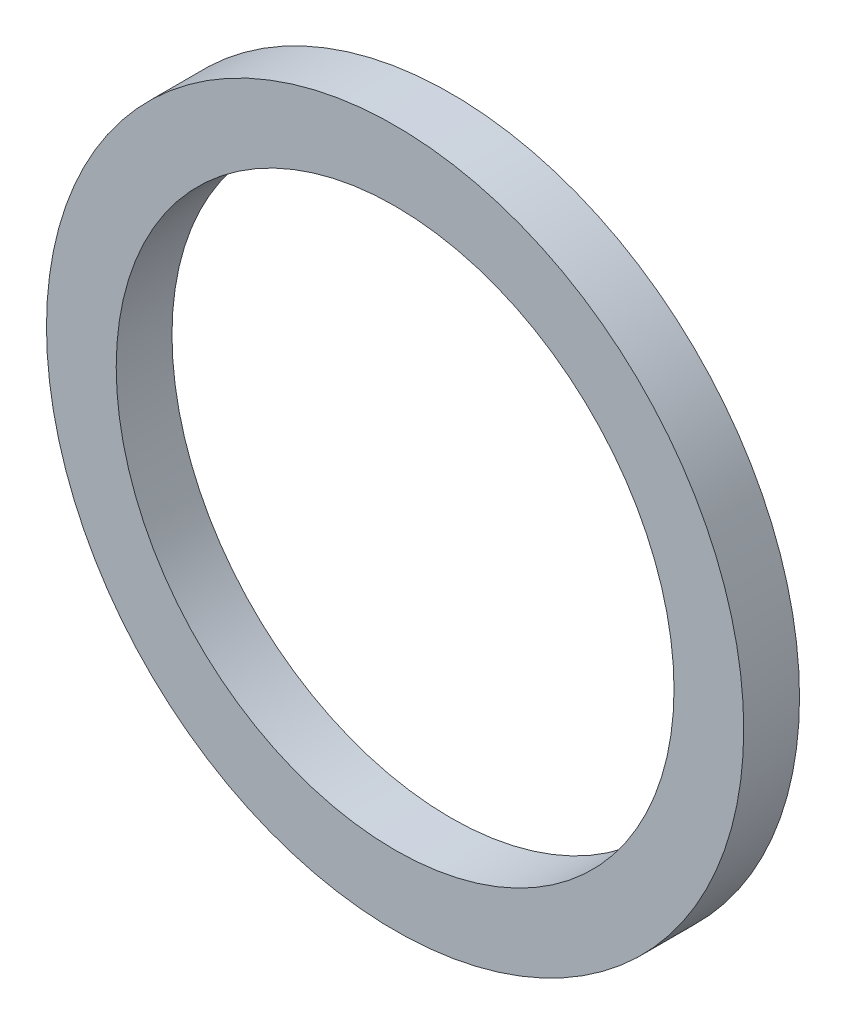
ISO-10303-21;
HEADER;
FILE_DESCRIPTION(('STEP AP214'),'2;1');
FILE_NAME('part.step','',(''),(''),'','','');
FILE_SCHEMA(('AUTOMOTIVE_DESIGN { 1 0 10303 214 1 1 1 1 }'));
ENDSEC;
DATA;
#1=APPLICATION_CONTEXT('core data for automotive mechanical design processes');
#2=APPLICATION_PROTOCOL_DEFINITION('international standard','automotive_design',2000,#1);
#3=PRODUCT_CONTEXT('',#1,'mechanical');
#4=PRODUCT('Part','Part','',(#3));
#5=PRODUCT_RELATED_PRODUCT_CATEGORY('part','',(#4));
#6=PRODUCT_DEFINITION_FORMATION('','',#4);
#7=PRODUCT_DEFINITION_CONTEXT('part definition',#1,'design');
#8=PRODUCT_DEFINITION('design','',#6,#7);
#9=PRODUCT_DEFINITION_SHAPE('','',#8);
#10=(LENGTH_UNIT() NAMED_UNIT(*) SI_UNIT(.MILLI.,.METRE.));
#11=(NAMED_UNIT(*) PLANE_ANGLE_UNIT() SI_UNIT($,.RADIAN.));
#12=(NAMED_UNIT(*) SI_UNIT($,.STERADIAN.) SOLID_ANGLE_UNIT());
#13=UNCERTAINTY_MEASURE_WITH_UNIT(LENGTH_MEASURE(1.E-05),#10,'distance_accuracy_value','');
#14=(GEOMETRIC_REPRESENTATION_CONTEXT(3) GLOBAL_UNCERTAINTY_ASSIGNED_CONTEXT((#13)) GLOBAL_UNIT_ASSIGNED_CONTEXT((#10,
#11,#12)) REPRESENTATION_CONTEXT('',''));
#15=CARTESIAN_POINT('',(0.,0.,0.));
#16=DIRECTION('',(0.,0.,1.));
#17=DIRECTION('',(1.,0.,0.));
#18=AXIS2_PLACEMENT_3D('',#15,#16,#17);
#19=CARTESIAN_POINT('',(0.,0.,0.2));
#20=DIRECTION('',(0.,0.,1.));
#21=DIRECTION('',(1.,0.,0.));
#22=AXIS2_PLACEMENT_3D('',#19,#20,#21);
#23=PLANE('',#22);
#24=CARTESIAN_POINT('',(0.,0.,0.2));
#25=DIRECTION('',(0.,0.,1.));
#26=DIRECTION('',(1.,0.,0.));
#27=AXIS2_PLACEMENT_3D('',#24,#25,#26);
#28=CIRCLE('',#27,1.25);
#29=CARTESIAN_POINT('',(1.25,0.,0.2));
#30=VERTEX_POINT('',#29);
#31=EDGE_CURVE('E10',#30,#30,#28,.T.);
#32=ORIENTED_EDGE('',*,*,#31,.T.);
#33=EDGE_LOOP('',(#32));
#34=FACE_BOUND('',#33,.T.);
#35=CARTESIAN_POINT('',(0.,0.,0.2));
#36=DIRECTION('',(0.,0.,1.));
#37=DIRECTION('',(1.,0.,0.));
#38=AXIS2_PLACEMENT_3D('',#35,#36,#37);
#39=CIRCLE('',#38,1.);
#40=CARTESIAN_POINT('',(1.,0.,0.2));
#41=VERTEX_POINT('',#40);
#42=EDGE_CURVE('E46',#41,#41,#39,.T.);
#43=ORIENTED_EDGE('',*,*,#42,.F.);
#44=EDGE_LOOP('',(#43));
#45=FACE_BOUND('',#44,.T.);
#46=ADVANCED_FACE('F35',(#34,#45),#23,.T.);
#47=CARTESIAN_POINT('',(0.,0.,0.));
#48=DIRECTION('',(0.,0.,1.));
#49=DIRECTION('',(1.,0.,0.));
#50=AXIS2_PLACEMENT_3D('',#47,#48,#49);
#51=PLANE('',#50);
#52=CARTESIAN_POINT('',(0.,0.,0.));
#53=DIRECTION('',(0.,0.,1.));
#54=DIRECTION('',(1.,0.,0.));
#55=AXIS2_PLACEMENT_3D('',#52,#53,#54);
#56=CIRCLE('',#55,1.25);
#57=CARTESIAN_POINT('',(1.25,0.,0.));
#58=VERTEX_POINT('',#57);
#59=EDGE_CURVE('E39',#58,#58,#56,.T.);
#60=ORIENTED_EDGE('',*,*,#59,.F.);
#61=EDGE_LOOP('',(#60));
#62=FACE_BOUND('',#61,.T.);
#63=CARTESIAN_POINT('',(0.,0.,0.));
#64=DIRECTION('',(0.,0.,1.));
#65=DIRECTION('',(1.,0.,0.));
#66=AXIS2_PLACEMENT_3D('',#63,#64,#65);
#67=CIRCLE('',#66,1.);
#68=CARTESIAN_POINT('',(1.,0.,0.));
#69=VERTEX_POINT('',#68);
#70=EDGE_CURVE('E48',#69,#69,#67,.T.);
#71=ORIENTED_EDGE('',*,*,#70,.T.);
#72=EDGE_LOOP('',(#71));
#73=FACE_BOUND('',#72,.T.);
#74=ADVANCED_FACE('F58',(#62,#73),#51,.F.);
#75=CARTESIAN_POINT('',(0.,0.,0.2));
#76=DIRECTION('',(0.,0.,-1.));
#77=DIRECTION('',(-1.,0.,0.));
#78=AXIS2_PLACEMENT_3D('',#75,#76,#77);
#79=CYLINDRICAL_SURFACE('',#78,1.25);
#80=ORIENTED_EDGE('',*,*,#31,.F.);
#81=EDGE_LOOP('',(#80));
#82=FACE_BOUND('',#81,.T.);
#83=ORIENTED_EDGE('',*,*,#59,.T.);
#84=EDGE_LOOP('',(#83));
#85=FACE_BOUND('',#84,.T.);
#86=ADVANCED_FACE('F37',(#82,#85),#79,.T.);
#87=CARTESIAN_POINT('',(0.,0.,0.2));
#88=DIRECTION('',(0.,0.,-1.));
#89=DIRECTION('',(-1.,0.,0.));
#90=AXIS2_PLACEMENT_3D('',#87,#88,#89);
#91=CYLINDRICAL_SURFACE('',#90,1.);
#92=ORIENTED_EDGE('',*,*,#42,.T.);
#93=EDGE_LOOP('',(#92));
#94=FACE_BOUND('',#93,.T.);
#95=ORIENTED_EDGE('',*,*,#70,.F.);
#96=EDGE_LOOP('',(#95));
#97=FACE_BOUND('',#96,.T.);
#98=ADVANCED_FACE('F54',(#94,#97),#91,.F.);
#99=CLOSED_SHELL('',(#46,#74,#86,#98));
#100=MANIFOLD_SOLID_BREP('B2',#99);
#101=ADVANCED_BREP_SHAPE_REPRESENTATION('',(#18,#100),#14);
#102=SHAPE_DEFINITION_REPRESENTATION(#9,#101);
ENDSEC;
END-ISO-10303-21;
